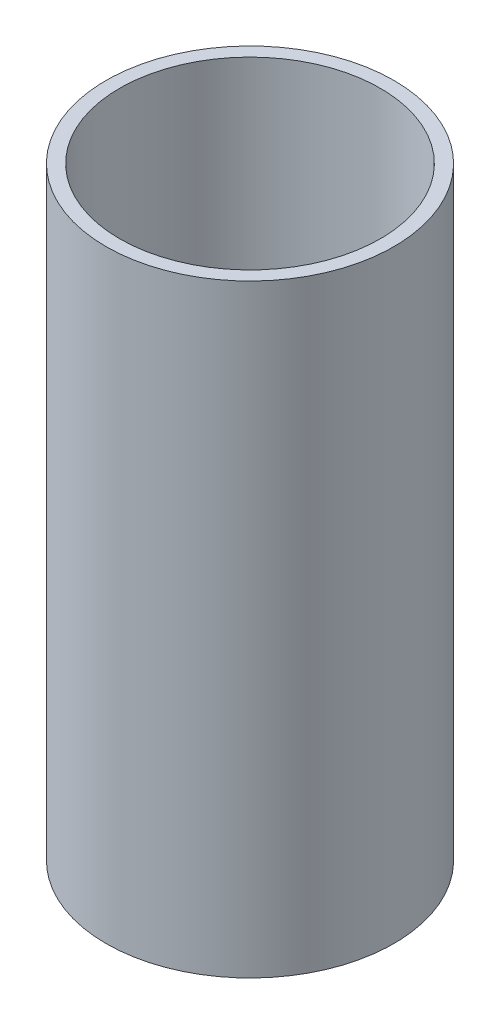
ISO-10303-21;
HEADER;
FILE_DESCRIPTION(('STEP AP214'),'2;1');
FILE_NAME('part.step','',(''),(''),'','','');
FILE_SCHEMA(('AUTOMOTIVE_DESIGN { 1 0 10303 214 1 1 1 1 }'));
ENDSEC;
DATA;
#1=APPLICATION_CONTEXT('core data for automotive mechanical design processes');
#2=APPLICATION_PROTOCOL_DEFINITION('international standard','automotive_design',2000,#1);
#3=PRODUCT_CONTEXT('',#1,'mechanical');
#4=PRODUCT('Part','Part','',(#3));
#5=PRODUCT_RELATED_PRODUCT_CATEGORY('part','',(#4));
#6=PRODUCT_DEFINITION_FORMATION('','',#4);
#7=PRODUCT_DEFINITION_CONTEXT('part definition',#1,'design');
#8=PRODUCT_DEFINITION('design','',#6,#7);
#9=PRODUCT_DEFINITION_SHAPE('','',#8);
#10=(LENGTH_UNIT() NAMED_UNIT(*) SI_UNIT(.MILLI.,.METRE.));
#11=(NAMED_UNIT(*) PLANE_ANGLE_UNIT() SI_UNIT($,.RADIAN.));
#12=(NAMED_UNIT(*) SI_UNIT($,.STERADIAN.) SOLID_ANGLE_UNIT());
#13=UNCERTAINTY_MEASURE_WITH_UNIT(LENGTH_MEASURE(1.E-05),#10,'distance_accuracy_value','');
#14=(GEOMETRIC_REPRESENTATION_CONTEXT(3) GLOBAL_UNCERTAINTY_ASSIGNED_CONTEXT((#13)) GLOBAL_UNIT_ASSIGNED_CONTEXT((#10,
#11,#12)) REPRESENTATION_CONTEXT('',''));
#15=CARTESIAN_POINT('',(0.,0.,0.));
#16=DIRECTION('',(0.,0.,1.));
#17=DIRECTION('',(1.,0.,0.));
#18=AXIS2_PLACEMENT_3D('',#15,#16,#17);
#19=CARTESIAN_POINT('',(0.,50.,0.));
#20=DIRECTION('',(0.,-1.,0.));
#21=DIRECTION('',(0.,0.,-1.));
#22=AXIS2_PLACEMENT_3D('',#19,#20,#21);
#23=CYLINDRICAL_SURFACE('',#22,9.525);
#24=CARTESIAN_POINT('',(0.,20.,0.));
#25=DIRECTION('',(0.,-1.,0.));
#26=DIRECTION('',(0.,0.,-1.));
#27=AXIS2_PLACEMENT_3D('',#24,#25,#26);
#28=CIRCLE('',#27,9.525);
#29=CARTESIAN_POINT('',(0.,20.,-9.525));
#30=VERTEX_POINT('',#29);
#31=EDGE_CURVE('E52',#30,#30,#28,.T.);
#32=ORIENTED_EDGE('',*,*,#31,.T.);
#33=EDGE_LOOP('',(#32));
#34=FACE_BOUND('',#33,.T.);
#35=CARTESIAN_POINT('',(0.,30.,0.));
#36=DIRECTION('',(0.,1.,0.));
#37=DIRECTION('',(0.,0.,1.));
#38=AXIS2_PLACEMENT_3D('',#35,#36,#37);
#39=CIRCLE('',#38,9.525);
#40=CARTESIAN_POINT('',(0.,30.,9.525));
#41=VERTEX_POINT('',#40);
#42=EDGE_CURVE('E41',#41,#41,#39,.T.);
#43=ORIENTED_EDGE('',*,*,#42,.T.);
#44=EDGE_LOOP('',(#43));
#45=FACE_BOUND('',#44,.T.);
#46=ADVANCED_FACE('F37',(#34,#45),#23,.F.);
#47=CARTESIAN_POINT('',(0.,50.,0.));
#48=DIRECTION('',(0.,1.,0.));
#49=DIRECTION('',(0.,0.,1.));
#50=AXIS2_PLACEMENT_3D('',#47,#48,#49);
#51=PLANE('',#50);
#52=CARTESIAN_POINT('',(0.,50.,0.));
#53=DIRECTION('',(0.,1.,0.));
#54=DIRECTION('',(0.,0.,1.));
#55=AXIS2_PLACEMENT_3D('',#52,#53,#54);
#56=CIRCLE('',#55,10.8);
#57=CARTESIAN_POINT('',(0.,50.,10.8));
#58=VERTEX_POINT('',#57);
#59=EDGE_CURVE('E69',#58,#58,#56,.T.);
#60=ORIENTED_EDGE('',*,*,#59,.F.);
#61=EDGE_LOOP('',(#60));
#62=FACE_BOUND('',#61,.T.);
#63=CARTESIAN_POINT('',(0.,50.,0.));
#64=DIRECTION('',(0.,1.,0.));
#65=DIRECTION('',(0.,0.,1.));
#66=AXIS2_PLACEMENT_3D('',#63,#64,#65);
#67=CIRCLE('',#66,11.925);
#68=CARTESIAN_POINT('',(0.,50.,11.925));
#69=VERTEX_POINT('',#68);
#70=EDGE_CURVE('E10',#69,#69,#67,.T.);
#71=ORIENTED_EDGE('',*,*,#70,.T.);
#72=EDGE_LOOP('',(#71));
#73=FACE_BOUND('',#72,.T.);
#74=ADVANCED_FACE('F94',(#62,#73),#51,.T.);
#75=CARTESIAN_POINT('',(0.,0.,0.));
#76=DIRECTION('',(0.,1.,0.));
#77=DIRECTION('',(0.,0.,1.));
#78=AXIS2_PLACEMENT_3D('',#75,#76,#77);
#79=PLANE('',#78);
#80=CARTESIAN_POINT('',(0.,0.,0.));
#81=DIRECTION('',(0.,-1.,0.));
#82=DIRECTION('',(0.,0.,-1.));
#83=AXIS2_PLACEMENT_3D('',#80,#81,#82);
#84=CIRCLE('',#83,10.85);
#85=CARTESIAN_POINT('',(0.,0.,-10.85));
#86=VERTEX_POINT('',#85);
#87=EDGE_CURVE('E55',#86,#86,#84,.T.);
#88=ORIENTED_EDGE('',*,*,#87,.F.);
#89=EDGE_LOOP('',(#88));
#90=FACE_BOUND('',#89,.T.);
#91=CARTESIAN_POINT('',(0.,0.,0.));
#92=DIRECTION('',(0.,1.,0.));
#93=DIRECTION('',(0.,0.,1.));
#94=AXIS2_PLACEMENT_3D('',#91,#92,#93);
#95=CIRCLE('',#94,11.925);
#96=CARTESIAN_POINT('',(0.,0.,11.925));
#97=VERTEX_POINT('',#96);
#98=EDGE_CURVE('E46',#97,#97,#95,.T.);
#99=ORIENTED_EDGE('',*,*,#98,.F.);
#100=EDGE_LOOP('',(#99));
#101=FACE_BOUND('',#100,.T.);
#102=ADVANCED_FACE('F99',(#90,#101),#79,.F.);
#103=CARTESIAN_POINT('',(0.,50.,0.));
#104=DIRECTION('',(0.,-1.,0.));
#105=DIRECTION('',(0.,0.,-1.));
#106=AXIS2_PLACEMENT_3D('',#103,#104,#105);
#107=CYLINDRICAL_SURFACE('',#106,11.925);
#108=ORIENTED_EDGE('',*,*,#70,.F.);
#109=EDGE_LOOP('',(#108));
#110=FACE_BOUND('',#109,.T.);
#111=ORIENTED_EDGE('',*,*,#98,.T.);
#112=EDGE_LOOP('',(#111));
#113=FACE_BOUND('',#112,.T.);
#114=ADVANCED_FACE('F39',(#110,#113),#107,.T.);
#115=CARTESIAN_POINT('',(0.,20.,0.));
#116=DIRECTION('',(0.,-1.,0.));
#117=DIRECTION('',(0.,0.,-1.));
#118=AXIS2_PLACEMENT_3D('',#115,#116,#117);
#119=CYLINDRICAL_SURFACE('',#118,10.85);
#120=CARTESIAN_POINT('',(0.,20.,0.));
#121=DIRECTION('',(0.,-1.,0.));
#122=DIRECTION('',(0.,0.,-1.));
#123=AXIS2_PLACEMENT_3D('',#120,#121,#122);
#124=CIRCLE('',#123,10.85);
#125=CARTESIAN_POINT('',(0.,20.,-10.85));
#126=VERTEX_POINT('',#125);
#127=EDGE_CURVE('E59',#126,#126,#124,.T.);
#128=ORIENTED_EDGE('',*,*,#127,.F.);
#129=EDGE_LOOP('',(#128));
#130=FACE_BOUND('',#129,.T.);
#131=ORIENTED_EDGE('',*,*,#87,.T.);
#132=EDGE_LOOP('',(#131));
#133=FACE_BOUND('',#132,.T.);
#134=ADVANCED_FACE('F103',(#130,#133),#119,.F.);
#135=CARTESIAN_POINT('',(0.,20.,0.));
#136=DIRECTION('',(0.,-1.,0.));
#137=DIRECTION('',(0.,0.,-1.));
#138=AXIS2_PLACEMENT_3D('',#135,#136,#137);
#139=PLANE('',#138);
#140=ORIENTED_EDGE('',*,*,#31,.F.);
#141=EDGE_LOOP('',(#140));
#142=FACE_BOUND('',#141,.T.);
#143=ORIENTED_EDGE('',*,*,#127,.T.);
#144=EDGE_LOOP('',(#143));
#145=FACE_BOUND('',#144,.T.);
#146=ADVANCED_FACE('F90',(#142,#145),#139,.T.);
#147=CARTESIAN_POINT('',(0.,30.,0.));
#148=DIRECTION('',(0.,1.,0.));
#149=DIRECTION('',(0.,0.,1.));
#150=AXIS2_PLACEMENT_3D('',#147,#148,#149);
#151=CYLINDRICAL_SURFACE('',#150,10.8);
#152=CARTESIAN_POINT('',(0.,30.,0.));
#153=DIRECTION('',(0.,1.,0.));
#154=DIRECTION('',(0.,0.,1.));
#155=AXIS2_PLACEMENT_3D('',#152,#153,#154);
#156=CIRCLE('',#155,10.8);
#157=CARTESIAN_POINT('',(0.,30.,10.8));
#158=VERTEX_POINT('',#157);
#159=EDGE_CURVE('E73',#158,#158,#156,.T.);
#160=ORIENTED_EDGE('',*,*,#159,.F.);
#161=EDGE_LOOP('',(#160));
#162=FACE_BOUND('',#161,.T.);
#163=ORIENTED_EDGE('',*,*,#59,.T.);
#164=EDGE_LOOP('',(#163));
#165=FACE_BOUND('',#164,.T.);
#166=ADVANCED_FACE('F85',(#162,#165),#151,.F.);
#167=CARTESIAN_POINT('',(0.,30.,0.));
#168=DIRECTION('',(0.,1.,0.));
#169=DIRECTION('',(0.,0.,1.));
#170=AXIS2_PLACEMENT_3D('',#167,#168,#169);
#171=PLANE('',#170);
#172=ORIENTED_EDGE('',*,*,#42,.F.);
#173=EDGE_LOOP('',(#172));
#174=FACE_BOUND('',#173,.T.);
#175=ORIENTED_EDGE('',*,*,#159,.T.);
#176=EDGE_LOOP('',(#175));
#177=FACE_BOUND('',#176,.T.);
#178=ADVANCED_FACE('F83',(#174,#177),#171,.T.);
#179=CLOSED_SHELL('',(#46,#74,#102,#114,#134,#146,#166,#178));
#180=MANIFOLD_SOLID_BREP('B2',#179);
#181=ADVANCED_BREP_SHAPE_REPRESENTATION('',(#18,#180),#14);
#182=SHAPE_DEFINITION_REPRESENTATION(#9,#181);
ENDSEC;
END-ISO-10303-21;
